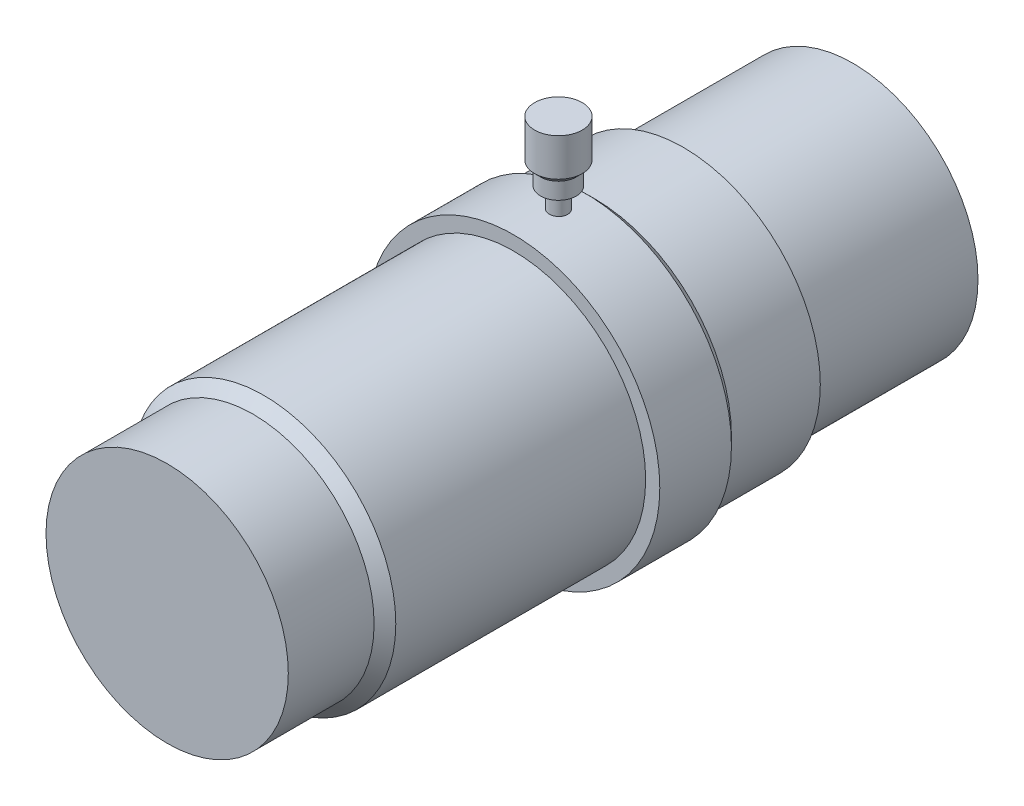
ISO-10303-21;
HEADER;
FILE_DESCRIPTION(('STEP AP214'),'2;1');
FILE_NAME('part.step','',(''),(''),'','','');
FILE_SCHEMA(('AUTOMOTIVE_DESIGN { 1 0 10303 214 1 1 1 1 }'));
ENDSEC;
DATA;
#1=APPLICATION_CONTEXT('core data for automotive mechanical design processes');
#2=APPLICATION_PROTOCOL_DEFINITION('international standard','automotive_design',2000,#1);
#3=PRODUCT_CONTEXT('',#1,'mechanical');
#4=PRODUCT('Part','Part','',(#3));
#5=PRODUCT_RELATED_PRODUCT_CATEGORY('part','',(#4));
#6=PRODUCT_DEFINITION_FORMATION('','',#4);
#7=PRODUCT_DEFINITION_CONTEXT('part definition',#1,'design');
#8=PRODUCT_DEFINITION('design','',#6,#7);
#9=PRODUCT_DEFINITION_SHAPE('','',#8);
#10=(LENGTH_UNIT() NAMED_UNIT(*) SI_UNIT(.MILLI.,.METRE.));
#11=(NAMED_UNIT(*) PLANE_ANGLE_UNIT() SI_UNIT($,.RADIAN.));
#12=(NAMED_UNIT(*) SI_UNIT($,.STERADIAN.) SOLID_ANGLE_UNIT());
#13=UNCERTAINTY_MEASURE_WITH_UNIT(LENGTH_MEASURE(1.E-05),#10,'distance_accuracy_value','');
#14=(GEOMETRIC_REPRESENTATION_CONTEXT(3) GLOBAL_UNCERTAINTY_ASSIGNED_CONTEXT((#13)) GLOBAL_UNIT_ASSIGNED_CONTEXT((#10,
#11,#12)) REPRESENTATION_CONTEXT('',''));
#15=CARTESIAN_POINT('',(0.,0.,0.));
#16=DIRECTION('',(0.,0.,1.));
#17=DIRECTION('',(1.,0.,0.));
#18=AXIS2_PLACEMENT_3D('',#15,#16,#17);
#19=CARTESIAN_POINT('',(0.,26.5,0.));
#20=DIRECTION('',(0.,0.,1.));
#21=DIRECTION('',(1.,0.,0.));
#22=AXIS2_PLACEMENT_3D('',#19,#20,#21);
#23=PLANE('',#22);
#24=CARTESIAN_POINT('',(0.,0.,0.));
#25=DIRECTION('',(0.,0.,1.));
#26=DIRECTION('',(1.,0.,0.));
#27=AXIS2_PLACEMENT_3D('',#24,#25,#26);
#28=CIRCLE('',#27,26.5);
#29=CARTESIAN_POINT('',(26.5,0.,0.));
#30=VERTEX_POINT('',#29);
#31=EDGE_CURVE('E82',#30,#30,#28,.T.);
#32=ORIENTED_EDGE('',*,*,#31,.F.);
#33=EDGE_LOOP('',(#32));
#34=FACE_BOUND('',#33,.T.);
#35=ADVANCED_FACE('F39',(#34),#23,.F.);
#36=CARTESIAN_POINT('',(0.,0.,145.5));
#37=DIRECTION('',(0.,0.,-1.));
#38=DIRECTION('',(-1.,0.,0.));
#39=AXIS2_PLACEMENT_3D('',#36,#37,#38);
#40=PLANE('',#39);
#41=CARTESIAN_POINT('',(0.,0.,145.5));
#42=DIRECTION('',(0.,0.,1.));
#43=DIRECTION('',(1.,0.,0.));
#44=AXIS2_PLACEMENT_3D('',#41,#42,#43);
#45=CIRCLE('',#44,25.7);
#46=CARTESIAN_POINT('',(25.7,0.,145.5));
#47=VERTEX_POINT('',#46);
#48=EDGE_CURVE('E10',#47,#47,#45,.T.);
#49=ORIENTED_EDGE('',*,*,#48,.T.);
#50=EDGE_LOOP('',(#49));
#51=FACE_BOUND('',#50,.T.);
#52=ADVANCED_FACE('F119',(#51),#40,.F.);
#53=CARTESIAN_POINT('',(0.,0.,0.));
#54=DIRECTION('',(0.,0.,1.));
#55=DIRECTION('',(1.,0.,0.));
#56=AXIS2_PLACEMENT_3D('',#53,#54,#55);
#57=CYLINDRICAL_SURFACE('',#56,25.7);
#58=ORIENTED_EDGE('',*,*,#48,.F.);
#59=EDGE_LOOP('',(#58));
#60=FACE_BOUND('',#59,.T.);
#61=CARTESIAN_POINT('',(0.,0.,127.3));
#62=DIRECTION('',(0.,0.,1.));
#63=DIRECTION('',(1.,0.,0.));
#64=AXIS2_PLACEMENT_3D('',#61,#62,#63);
#65=CIRCLE('',#64,25.7);
#66=CARTESIAN_POINT('',(25.7,0.,127.3));
#67=VERTEX_POINT('',#66);
#68=EDGE_CURVE('E51',#67,#67,#65,.T.);
#69=ORIENTED_EDGE('',*,*,#68,.T.);
#70=EDGE_LOOP('',(#69));
#71=FACE_BOUND('',#70,.T.);
#72=ADVANCED_FACE('F124',(#60,#71),#57,.T.);
#73=CARTESIAN_POINT('',(0.,0.,125.));
#74=DIRECTION('',(0.,0.,-1.));
#75=DIRECTION('',(-1.,0.,0.));
#76=AXIS2_PLACEMENT_3D('',#73,#74,#75);
#77=CONICAL_SURFACE('',#76,28.,0.785398163397446);
#78=ORIENTED_EDGE('',*,*,#68,.F.);
#79=EDGE_LOOP('',(#78));
#80=FACE_BOUND('',#79,.T.);
#81=CARTESIAN_POINT('',(0.,0.,125.));
#82=DIRECTION('',(0.,0.,1.));
#83=DIRECTION('',(1.,0.,0.));
#84=AXIS2_PLACEMENT_3D('',#81,#82,#83);
#85=CIRCLE('',#84,28.);
#86=CARTESIAN_POINT('',(28.,0.,125.));
#87=VERTEX_POINT('',#86);
#88=EDGE_CURVE('E55',#87,#87,#85,.T.);
#89=ORIENTED_EDGE('',*,*,#88,.T.);
#90=EDGE_LOOP('',(#89));
#91=FACE_BOUND('',#90,.T.);
#92=ADVANCED_FACE('F162',(#80,#91),#77,.T.);
#93=CARTESIAN_POINT('',(0.,0.,0.));
#94=DIRECTION('',(0.,0.,1.));
#95=DIRECTION('',(1.,0.,0.));
#96=AXIS2_PLACEMENT_3D('',#93,#94,#95);
#97=CYLINDRICAL_SURFACE('',#96,28.);
#98=ORIENTED_EDGE('',*,*,#88,.F.);
#99=EDGE_LOOP('',(#98));
#100=FACE_BOUND('',#99,.T.);
#101=CARTESIAN_POINT('',(0.,0.,72.));
#102=DIRECTION('',(0.,0.,1.));
#103=DIRECTION('',(1.,0.,0.));
#104=AXIS2_PLACEMENT_3D('',#101,#102,#103);
#105=CIRCLE('',#104,28.);
#106=CARTESIAN_POINT('',(28.,0.,72.));
#107=VERTEX_POINT('',#106);
#108=EDGE_CURVE('E60',#107,#107,#105,.T.);
#109=ORIENTED_EDGE('',*,*,#108,.T.);
#110=EDGE_LOOP('',(#109));
#111=FACE_BOUND('',#110,.T.);
#112=ADVANCED_FACE('F158',(#100,#111),#97,.T.);
#113=CARTESIAN_POINT('',(0.,28.,72.));
#114=DIRECTION('',(0.,0.,-1.));
#115=DIRECTION('',(-1.,0.,0.));
#116=AXIS2_PLACEMENT_3D('',#113,#114,#115);
#117=PLANE('',#116);
#118=ORIENTED_EDGE('',*,*,#108,.F.);
#119=EDGE_LOOP('',(#118));
#120=FACE_BOUND('',#119,.T.);
#121=CARTESIAN_POINT('',(0.,0.,72.));
#122=DIRECTION('',(0.,0.,1.));
#123=DIRECTION('',(1.,0.,0.));
#124=AXIS2_PLACEMENT_3D('',#121,#122,#123);
#125=CIRCLE('',#124,31.);
#126=CARTESIAN_POINT('',(31.,0.,72.));
#127=VERTEX_POINT('',#126);
#128=EDGE_CURVE('E64',#127,#127,#125,.T.);
#129=ORIENTED_EDGE('',*,*,#128,.T.);
#130=EDGE_LOOP('',(#129));
#131=FACE_BOUND('',#130,.T.);
#132=ADVANCED_FACE('F154',(#120,#131),#117,.F.);
#133=CARTESIAN_POINT('',(0.,0.,0.));
#134=DIRECTION('',(0.,0.,1.));
#135=DIRECTION('',(1.,0.,0.));
#136=AXIS2_PLACEMENT_3D('',#133,#134,#135);
#137=CYLINDRICAL_SURFACE('',#136,31.);
#138=CARTESIAN_POINT('',(0.,31.,60.55));
#139=CARTESIAN_POINT('',(0.109416282058807,30.9999991848793,60.550004813768));
#140=CARTESIAN_POINT('',(0.218909141328157,30.999414518604,60.5592401173705));
#141=CARTESIAN_POINT('',(0.434871412197759,30.9971383780475,60.5959489596203));
#142=CARTESIAN_POINT('',(0.541337155889376,30.9954456161448,60.6234437165278));
#143=CARTESIAN_POINT('',(0.748085718076635,30.9911447776922,60.6958785387023));
#144=CARTESIAN_POINT('',(0.848371769677925,30.9885371846288,60.7408093903568));
#145=CARTESIAN_POINT('',(1.03995232660732,30.9826999508486,60.846826017892));
#146=CARTESIAN_POINT('',(1.13124888234313,30.9794704524809,60.9079080980819));
#147=CARTESIAN_POINT('',(1.30242339108968,30.9727469357104,61.0445946853356));
#148=CARTESIAN_POINT('',(1.38228592552321,30.969252569665,61.1202184857912));
#149=CARTESIAN_POINT('',(1.52819352602546,30.962396119656,61.2838020531664));
#150=CARTESIAN_POINT('',(1.59423801423362,30.9590340412294,61.3717623357318));
#151=CARTESIAN_POINT('',(1.71068237288467,30.9528186306013,61.5576094401854));
#152=CARTESIAN_POINT('',(1.76106941760747,30.9499657162891,61.6555043133334));
#153=CARTESIAN_POINT('',(1.84468651881647,30.945094863219,61.8583852846609));
#154=CARTESIAN_POINT('',(1.87791676177645,30.9430769153862,61.9633713057541));
#155=CARTESIAN_POINT('',(1.92623413656566,30.9401068741291,62.1773057257609));
#156=CARTESIAN_POINT('',(1.94134544466181,30.9391533605378,62.2862486443987));
#157=CARTESIAN_POINT('',(1.95307062749699,30.9384154627238,62.5051285933809));
#158=CARTESIAN_POINT('',(1.94968471401712,30.9386310651155,62.6150656123291));
#159=CARTESIAN_POINT('',(1.92453162950666,30.9402057673128,62.8326482999341));
#160=CARTESIAN_POINT('',(1.90279062301838,30.941563239413,62.9402970066922));
#161=CARTESIAN_POINT('',(1.8415850838704,30.9452661395654,63.1504140300465));
#162=CARTESIAN_POINT('',(1.80212044389433,30.9476115735998,63.2528823152713));
#163=CARTESIAN_POINT('',(1.7065581987079,30.9530279559537,63.4498138376635));
#164=CARTESIAN_POINT('',(1.6504487267317,30.9560994215717,63.5442713016054));
#165=CARTESIAN_POINT('',(1.52319815961848,30.9626212164699,63.7224367609307));
#166=CARTESIAN_POINT('',(1.45205689323246,30.9660715500661,63.8061446338325));
#167=CARTESIAN_POINT('',(1.29661482375595,30.9729694802893,63.9605869808633));
#168=CARTESIAN_POINT('',(1.21229137706138,30.9764170617518,64.0312986675002));
#169=CARTESIAN_POINT('',(1.03295795650466,30.9829152089876,64.1575656178091));
#170=CARTESIAN_POINT('',(0.937947978863633,30.9859657746207,64.2131208761216));
#171=CARTESIAN_POINT('',(0.739924646324802,30.991326385109,64.3074960376672));
#172=CARTESIAN_POINT('',(0.636910877844784,30.9936363916656,64.346315075405));
#173=CARTESIAN_POINT('',(0.425810332980197,30.997255065303,64.4061006302532));
#174=CARTESIAN_POINT('',(0.317723616622818,30.9985637442293,64.4270673585501));
#175=CARTESIAN_POINT('',(0.0997430721891859,31.0000307689362,64.4505248838769));
#176=CARTESIAN_POINT('',(-0.010147352897402,31.0001910762606,64.4530471861483));
#177=CARTESIAN_POINT('',(-0.228789735838655,30.9993485112854,64.4396265823079));
#178=CARTESIAN_POINT('',(-0.337541699692605,30.9983456451182,64.4236837735502));
#179=CARTESIAN_POINT('',(-0.550731317265449,30.9952908915762,64.3738115924386));
#180=CARTESIAN_POINT('',(-0.65517236607065,30.99323984742,64.3398966771413));
#181=CARTESIAN_POINT('',(-0.856880248332628,30.988319481901,64.2550576885331));
#182=CARTESIAN_POINT('',(-0.954147016424914,30.9854501530839,64.2041334602746));
#183=CARTESIAN_POINT('',(-1.13888954676863,30.9792107270956,64.0866412155412));
#184=CARTESIAN_POINT('',(-1.22635190587013,30.975839958723,64.0200521603869));
#185=CARTESIAN_POINT('',(-1.38886794923884,30.9689792364072,63.8731511006108));
#186=CARTESIAN_POINT('',(-1.46392150977807,30.965489281276,63.7928389591725));
#187=CARTESIAN_POINT('',(-1.5995962037316,30.958777846141,63.6206355573884));
#188=CARTESIAN_POINT('',(-1.66019689586596,30.9555567505298,63.528728174853));
#189=CARTESIAN_POINT('',(-1.76510578892182,30.9497524041089,63.3360242262953));
#190=CARTESIAN_POINT('',(-1.80941409136678,30.9471691493248,63.235227715669));
#191=CARTESIAN_POINT('',(-1.88044506896945,30.9429345778811,63.0276813798342));
#192=CARTESIAN_POINT('',(-1.90718060407566,30.9412825798438,62.9209359702952));
#193=CARTESIAN_POINT('',(-1.94234912111917,30.9390949312441,62.7044606197557));
#194=CARTESIAN_POINT('',(-1.95078228751393,30.9385592694309,62.5947307088453));
#195=CARTESIAN_POINT('',(-1.94910489449153,30.9386649731718,62.3756044442565));
#196=CARTESIAN_POINT('',(-1.93902647178986,30.9393042989108,62.2662078421394));
#197=CARTESIAN_POINT('',(-1.90067862382088,30.9416836117177,62.050663488618));
#198=CARTESIAN_POINT('',(-1.87240916566413,30.9434236007755,61.9445157430879));
#199=CARTESIAN_POINT('',(-1.79848895779435,30.9478076599397,61.7384774356747));
#200=CARTESIAN_POINT('',(-1.75283834388289,30.9504517229825,61.6385868249107));
#201=CARTESIAN_POINT('',(-1.64545609257866,30.9563459243152,61.4478837336852));
#202=CARTESIAN_POINT('',(-1.58372486897218,30.9595960470094,61.3570710197144));
#203=CARTESIAN_POINT('',(-1.44581489696325,30.9663426925503,61.1869385813288));
#204=CARTESIAN_POINT('',(-1.36961290800381,30.9698396059955,61.107637711879));
#205=CARTESIAN_POINT('',(-1.20495586209475,30.9766824565154,60.9629262250121));
#206=CARTESIAN_POINT('',(-1.11649781235722,30.980028356449,60.8975190101762));
#207=CARTESIAN_POINT('',(-0.929737787114341,30.9861956681789,60.7824026921265));
#208=CARTESIAN_POINT('',(-0.831423670164894,30.989016420535,60.7327132721362));
#209=CARTESIAN_POINT('',(-0.627901775523872,30.9938067593313,60.650607409687));
#210=CARTESIAN_POINT('',(-0.522702232053204,30.9957773418114,60.6181707438514));
#211=CARTESIAN_POINT('',(-0.347382895138236,30.9981290802906,60.5799188354172));
#212=CARTESIAN_POINT('',(-0.278396259270662,30.9988275558715,60.5687137867309));
#213=CARTESIAN_POINT('',(-0.139616809831639,30.9997632754874,60.5537528382922));
#214=CARTESIAN_POINT('',(-0.0698239973908221,31.0000005201693,60.5499969280941));
#215=CARTESIAN_POINT('',(0.,31.,60.55));
#216=B_SPLINE_CURVE_WITH_KNOTS('',3,(#138,#139,#140,#141,#142,#143,#144,#145,#146,#147,#148,
#149,#150,#151,#152,#153,#154,#155,#156,#157,#158,#159,#160,#161,#162,#163,#164,#165,#166,#167,
#168,#169,#170,#171,#172,#173,#174,#175,#176,#177,#178,#179,#180,#181,#182,#183,#184,#185,#186,
#187,#188,#189,#190,#191,#192,#193,#194,#195,#196,#197,#198,#199,#200,#201,#202,#203,#204,#205,
#206,#207,#208,#209,#210,#211,#212,#213,#214,#215),.UNSPECIFIED.,.T.,.F.,(4,2,2,2,2,2,2,2,2,2,2,
2,2,2,2,2,2,2,2,2,2,2,2,2,2,2,2,2,2,2,2,2,2,2,2,2,2,2,4),(0.,0.327993946542121,
0.656369704461975,0.984572177236716,1.31269961628664,1.64126544398019,1.96984500931069,
2.2986930238002,2.62753746403254,2.95594263397374,3.2843440438982,3.61227811796325,
3.94021417769121,4.26838460034261,4.59655876186135,4.92530296530554,5.2540472849976,
5.58280860330265,5.91156603242016,6.23976177385572,6.56795578494504,6.89588619127145,
7.22381958498539,7.55219595048811,7.88057559003046,8.20941695195082,8.53825626471354,
8.86685466044276,9.19544974443066,9.52347491584501,9.85150068033169,10.179523881957,
10.5075386437222,10.8360847335544,11.1647111923917,11.4937475721018,11.8223974063597,
12.0317070278504,12.2410163558282),.UNSPECIFIED.);
#217=CARTESIAN_POINT('',(0.,31.,60.55));
#218=VERTEX_POINT('',#217);
#219=EDGE_CURVE('E42',#218,#218,#216,.T.);
#220=ORIENTED_EDGE('',*,*,#219,.T.);
#221=EDGE_LOOP('',(#220));
#222=FACE_BOUND('',#221,.T.);
#223=ORIENTED_EDGE('',*,*,#128,.F.);
#224=EDGE_LOOP('',(#223));
#225=FACE_BOUND('',#224,.T.);
#226=CARTESIAN_POINT('',(0.,0.,56.8));
#227=DIRECTION('',(0.,0.,1.));
#228=DIRECTION('',(1.,0.,0.));
#229=AXIS2_PLACEMENT_3D('',#226,#227,#228);
#230=CIRCLE('',#229,31.);
#231=CARTESIAN_POINT('',(31.,0.,56.8));
#232=VERTEX_POINT('',#231);
#233=EDGE_CURVE('E68',#232,#232,#230,.T.);
#234=ORIENTED_EDGE('',*,*,#233,.T.);
#235=EDGE_LOOP('',(#234));
#236=FACE_BOUND('',#235,.T.);
#237=ADVANCED_FACE('F149',(#222,#225,#236),#137,.T.);
#238=CARTESIAN_POINT('',(0.,0.,54.85));
#239=DIRECTION('',(0.,0.,1.));
#240=DIRECTION('',(1.,0.,0.));
#241=AXIS2_PLACEMENT_3D('',#238,#239,#240);
#242=CONICAL_SURFACE('',#241,29.05,0.785398163397447);
#243=ORIENTED_EDGE('',*,*,#233,.F.);
#244=EDGE_LOOP('',(#243));
#245=FACE_BOUND('',#244,.T.);
#246=CARTESIAN_POINT('',(0.,0.,54.85));
#247=DIRECTION('',(0.,0.,1.));
#248=DIRECTION('',(1.,0.,0.));
#249=AXIS2_PLACEMENT_3D('',#246,#247,#248);
#250=CIRCLE('',#249,29.05);
#251=CARTESIAN_POINT('',(29.05,0.,54.85));
#252=VERTEX_POINT('',#251);
#253=EDGE_CURVE('E72',#252,#252,#250,.T.);
#254=ORIENTED_EDGE('',*,*,#253,.T.);
#255=EDGE_LOOP('',(#254));
#256=FACE_BOUND('',#255,.T.);
#257=ADVANCED_FACE('F146',(#245,#256),#242,.T.);
#258=CARTESIAN_POINT('',(0.,0.,0.));
#259=DIRECTION('',(0.,0.,1.));
#260=DIRECTION('',(1.,0.,0.));
#261=AXIS2_PLACEMENT_3D('',#258,#259,#260);
#262=CYLINDRICAL_SURFACE('',#261,29.05);
#263=ORIENTED_EDGE('',*,*,#253,.F.);
#264=EDGE_LOOP('',(#263));
#265=FACE_BOUND('',#264,.T.);
#266=CARTESIAN_POINT('',(0.,0.,36.));
#267=DIRECTION('',(0.,0.,1.));
#268=DIRECTION('',(1.,0.,0.));
#269=AXIS2_PLACEMENT_3D('',#266,#267,#268);
#270=CIRCLE('',#269,29.05);
#271=CARTESIAN_POINT('',(29.05,0.,36.));
#272=VERTEX_POINT('',#271);
#273=EDGE_CURVE('E76',#272,#272,#270,.T.);
#274=ORIENTED_EDGE('',*,*,#273,.T.);
#275=EDGE_LOOP('',(#274));
#276=FACE_BOUND('',#275,.T.);
#277=ADVANCED_FACE('F137',(#265,#276),#262,.T.);
#278=CARTESIAN_POINT('',(0.,29.05,36.));
#279=DIRECTION('',(0.,0.,1.));
#280=DIRECTION('',(1.,0.,0.));
#281=AXIS2_PLACEMENT_3D('',#278,#279,#280);
#282=PLANE('',#281);
#283=ORIENTED_EDGE('',*,*,#273,.F.);
#284=EDGE_LOOP('',(#283));
#285=FACE_BOUND('',#284,.T.);
#286=CARTESIAN_POINT('',(0.,0.,36.));
#287=DIRECTION('',(0.,0.,1.));
#288=DIRECTION('',(1.,0.,0.));
#289=AXIS2_PLACEMENT_3D('',#286,#287,#288);
#290=CIRCLE('',#289,26.5);
#291=CARTESIAN_POINT('',(26.5,0.,36.));
#292=VERTEX_POINT('',#291);
#293=EDGE_CURVE('E79',#292,#292,#290,.T.);
#294=ORIENTED_EDGE('',*,*,#293,.T.);
#295=EDGE_LOOP('',(#294));
#296=FACE_BOUND('',#295,.T.);
#297=ADVANCED_FACE('F129',(#285,#296),#282,.F.);
#298=CARTESIAN_POINT('',(0.,0.,0.));
#299=DIRECTION('',(0.,0.,1.));
#300=DIRECTION('',(1.,0.,0.));
#301=AXIS2_PLACEMENT_3D('',#298,#299,#300);
#302=CYLINDRICAL_SURFACE('',#301,26.5);
#303=ORIENTED_EDGE('',*,*,#293,.F.);
#304=EDGE_LOOP('',(#303));
#305=FACE_BOUND('',#304,.T.);
#306=ORIENTED_EDGE('',*,*,#31,.T.);
#307=EDGE_LOOP('',(#306));
#308=FACE_BOUND('',#307,.T.);
#309=ADVANCED_FACE('F127',(#305,#308),#302,.T.);
#310=CARTESIAN_POINT('',(0.,48.,62.5));
#311=DIRECTION('',(0.,-1.,0.));
#312=DIRECTION('',(0.,0.,-1.));
#313=AXIS2_PLACEMENT_3D('',#310,#311,#312);
#314=CYLINDRICAL_SURFACE('',#313,1.95);
#315=CARTESIAN_POINT('',(0.,35.25,62.5));
#316=DIRECTION('',(0.,-1.,0.));
#317=DIRECTION('',(0.,0.,-1.));
#318=AXIS2_PLACEMENT_3D('',#315,#316,#317);
#319=CIRCLE('',#318,1.95);
#320=CARTESIAN_POINT('',(0.,35.25,60.55));
#321=VERTEX_POINT('',#320);
#322=EDGE_CURVE('E100',#321,#321,#319,.T.);
#323=ORIENTED_EDGE('',*,*,#322,.T.);
#324=EDGE_LOOP('',(#323));
#325=FACE_BOUND('',#324,.T.);
#326=ORIENTED_EDGE('',*,*,#219,.F.);
#327=EDGE_LOOP('',(#326));
#328=FACE_BOUND('',#327,.T.);
#329=ADVANCED_FACE('F104',(#325,#328),#314,.T.);
#330=CARTESIAN_POINT('',(0.,48.,62.5));
#331=DIRECTION('',(0.,1.,0.));
#332=DIRECTION('',(0.,0.,1.));
#333=AXIS2_PLACEMENT_3D('',#330,#331,#332);
#334=PLANE('',#333);
#335=CARTESIAN_POINT('',(0.,48.,62.5));
#336=DIRECTION('',(0.,-1.,0.));
#337=DIRECTION('',(0.,0.,-1.));
#338=AXIS2_PLACEMENT_3D('',#335,#336,#337);
#339=CIRCLE('',#338,5.05);
#340=CARTESIAN_POINT('',(0.,48.,57.45));
#341=VERTEX_POINT('',#340);
#342=EDGE_CURVE('E85',#341,#341,#339,.T.);
#343=ORIENTED_EDGE('',*,*,#342,.F.);
#344=EDGE_LOOP('',(#343));
#345=FACE_BOUND('',#344,.T.);
#346=ADVANCED_FACE('F136',(#345),#334,.T.);
#347=CARTESIAN_POINT('',(0.,48.,62.5));
#348=DIRECTION('',(0.,-1.,0.));
#349=DIRECTION('',(0.,0.,-1.));
#350=AXIS2_PLACEMENT_3D('',#347,#348,#349);
#351=CYLINDRICAL_SURFACE('',#350,5.05);
#352=ORIENTED_EDGE('',*,*,#342,.T.);
#353=EDGE_LOOP('',(#352));
#354=FACE_BOUND('',#353,.T.);
#355=CARTESIAN_POINT('',(0.,40.,62.5));
#356=DIRECTION('',(0.,-1.,0.));
#357=DIRECTION('',(0.,0.,-1.));
#358=AXIS2_PLACEMENT_3D('',#355,#356,#357);
#359=CIRCLE('',#358,5.04999999999999);
#360=CARTESIAN_POINT('',(0.,40.,57.45));
#361=VERTEX_POINT('',#360);
#362=EDGE_CURVE('E88',#361,#361,#359,.T.);
#363=ORIENTED_EDGE('',*,*,#362,.F.);
#364=EDGE_LOOP('',(#363));
#365=FACE_BOUND('',#364,.T.);
#366=ADVANCED_FACE('F243',(#354,#365),#351,.T.);
#367=CARTESIAN_POINT('',(0.,38.75,62.5));
#368=DIRECTION('',(0.,1.,0.));
#369=DIRECTION('',(0.,0.,1.));
#370=AXIS2_PLACEMENT_3D('',#367,#368,#369);
#371=CONICAL_SURFACE('',#370,3.8,0.785398163397448);
#372=ORIENTED_EDGE('',*,*,#362,.T.);
#373=EDGE_LOOP('',(#372));
#374=FACE_BOUND('',#373,.T.);
#375=CARTESIAN_POINT('',(0.,38.75,62.5));
#376=DIRECTION('',(0.,-1.,0.));
#377=DIRECTION('',(0.,0.,-1.));
#378=AXIS2_PLACEMENT_3D('',#375,#376,#377);
#379=CIRCLE('',#378,3.8);
#380=CARTESIAN_POINT('',(0.,38.75,58.7));
#381=VERTEX_POINT('',#380);
#382=EDGE_CURVE('E92',#381,#381,#379,.T.);
#383=ORIENTED_EDGE('',*,*,#382,.F.);
#384=EDGE_LOOP('',(#383));
#385=FACE_BOUND('',#384,.T.);
#386=ADVANCED_FACE('F115',(#374,#385),#371,.T.);
#387=CARTESIAN_POINT('',(0.,48.,62.5));
#388=DIRECTION('',(0.,-1.,0.));
#389=DIRECTION('',(0.,0.,-1.));
#390=AXIS2_PLACEMENT_3D('',#387,#388,#389);
#391=CYLINDRICAL_SURFACE('',#390,3.8);
#392=ORIENTED_EDGE('',*,*,#382,.T.);
#393=EDGE_LOOP('',(#392));
#394=FACE_BOUND('',#393,.T.);
#395=CARTESIAN_POINT('',(0.,35.25,62.5));
#396=DIRECTION('',(0.,-1.,0.));
#397=DIRECTION('',(0.,0.,-1.));
#398=AXIS2_PLACEMENT_3D('',#395,#396,#397);
#399=CIRCLE('',#398,3.8);
#400=CARTESIAN_POINT('',(0.,35.25,58.7));
#401=VERTEX_POINT('',#400);
#402=EDGE_CURVE('E96',#401,#401,#399,.T.);
#403=ORIENTED_EDGE('',*,*,#402,.F.);
#404=EDGE_LOOP('',(#403));
#405=FACE_BOUND('',#404,.T.);
#406=ADVANCED_FACE('F109',(#394,#405),#391,.T.);
#407=CARTESIAN_POINT('',(0.,35.25,58.7));
#408=DIRECTION('',(0.,-1.,0.));
#409=DIRECTION('',(0.,0.,-1.));
#410=AXIS2_PLACEMENT_3D('',#407,#408,#409);
#411=PLANE('',#410);
#412=ORIENTED_EDGE('',*,*,#402,.T.);
#413=EDGE_LOOP('',(#412));
#414=FACE_BOUND('',#413,.T.);
#415=ORIENTED_EDGE('',*,*,#322,.F.);
#416=EDGE_LOOP('',(#415));
#417=FACE_BOUND('',#416,.T.);
#418=ADVANCED_FACE('F107',(#414,#417),#411,.T.);
#419=CLOSED_SHELL('',(#35,#52,#72,#92,#112,#132,#237,#257,#277,#297,#309,#329,#346,#366,#386,
#406,#418));
#420=MANIFOLD_SOLID_BREP('B2',#419);
#421=ADVANCED_BREP_SHAPE_REPRESENTATION('',(#18,#420),#14);
#422=SHAPE_DEFINITION_REPRESENTATION(#9,#421);
ENDSEC;
END-ISO-10303-21;
